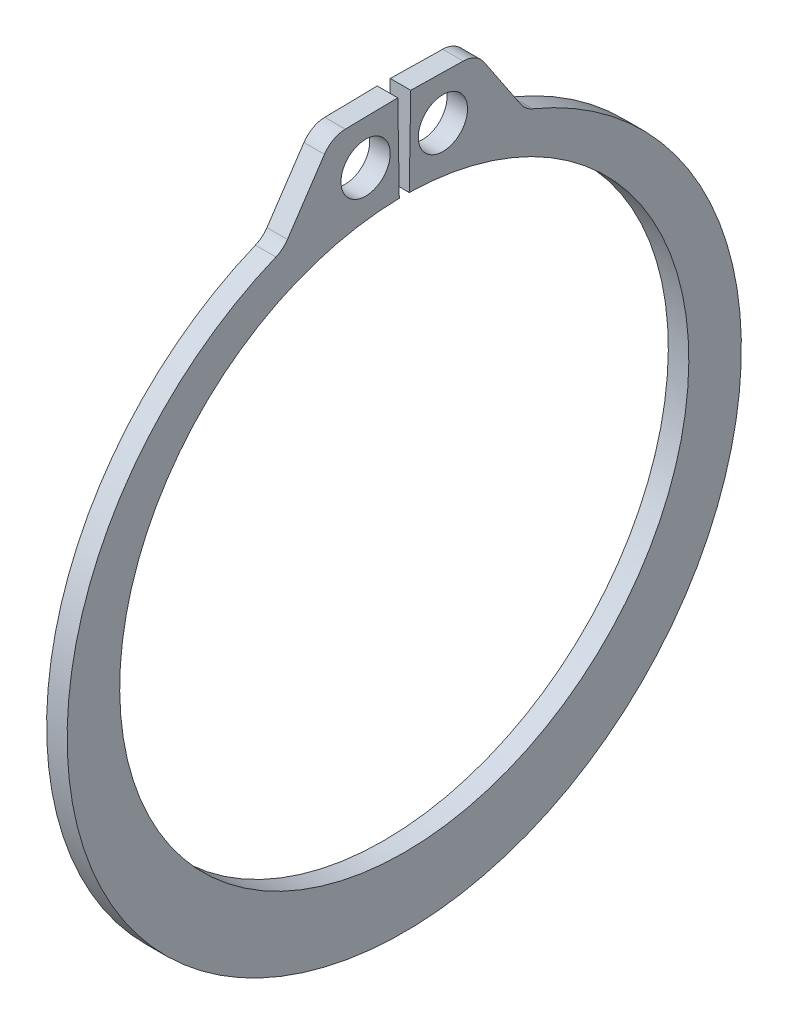
ISO-10303-21;
HEADER;
FILE_DESCRIPTION(('STEP AP214'),'2;1');
FILE_NAME('part.step','',(''),(''),'','','');
FILE_SCHEMA(('AUTOMOTIVE_DESIGN { 1 0 10303 214 1 1 1 1 }'));
ENDSEC;
DATA;
#1=APPLICATION_CONTEXT('core data for automotive mechanical design processes');
#2=APPLICATION_PROTOCOL_DEFINITION('international standard','automotive_design',2000,#1);
#3=PRODUCT_CONTEXT('',#1,'mechanical');
#4=PRODUCT('Part','Part','',(#3));
#5=PRODUCT_RELATED_PRODUCT_CATEGORY('part','',(#4));
#6=PRODUCT_DEFINITION_FORMATION('','',#4);
#7=PRODUCT_DEFINITION_CONTEXT('part definition',#1,'design');
#8=PRODUCT_DEFINITION('design','',#6,#7);
#9=PRODUCT_DEFINITION_SHAPE('','',#8);
#10=(LENGTH_UNIT() NAMED_UNIT(*) SI_UNIT(.MILLI.,.METRE.));
#11=(NAMED_UNIT(*) PLANE_ANGLE_UNIT() SI_UNIT($,.RADIAN.));
#12=(NAMED_UNIT(*) SI_UNIT($,.STERADIAN.) SOLID_ANGLE_UNIT());
#13=UNCERTAINTY_MEASURE_WITH_UNIT(LENGTH_MEASURE(1.E-05),#10,'distance_accuracy_value','');
#14=(GEOMETRIC_REPRESENTATION_CONTEXT(3) GLOBAL_UNCERTAINTY_ASSIGNED_CONTEXT((#13)) GLOBAL_UNIT_ASSIGNED_CONTEXT((#10,
#11,#12)) REPRESENTATION_CONTEXT('',''));
#15=CARTESIAN_POINT('',(0.,0.,0.));
#16=DIRECTION('',(0.,0.,1.));
#17=DIRECTION('',(1.,0.,0.));
#18=AXIS2_PLACEMENT_3D('',#15,#16,#17);
#19=CARTESIAN_POINT('',(0.635,0.,0.));
#20=DIRECTION('',(1.,0.,0.));
#21=DIRECTION('',(0.,0.,-1.));
#22=AXIS2_PLACEMENT_3D('',#19,#20,#21);
#23=PLANE('',#22);
#24=CARTESIAN_POINT('',(0.635,20.2940291186449,2.39289409378939));
#25=DIRECTION('',(1.,0.,0.));
#26=DIRECTION('',(0.,0.,-1.));
#27=AXIS2_PLACEMENT_3D('',#24,#25,#26);
#28=CIRCLE('',#27,1.524);
#29=CARTESIAN_POINT('',(0.635,20.2940291186449,0.868894093789386));
#30=VERTEX_POINT('',#29);
#31=EDGE_CURVE('E221',#30,#30,#28,.T.);
#32=ORIENTED_EDGE('',*,*,#31,.F.);
#33=EDGE_LOOP('',(#32));
#34=FACE_BOUND('',#33,.T.);
#35=DIRECTION('',(0.,-0.0174524064372847,0.999847695156391));
#36=VECTOR('',#35,1.);
#37=CARTESIAN_POINT('',(0.635,23.0469892972024,0.402286694582603));
#38=LINE('',#37,#36);
#39=CARTESIAN_POINT('',(0.635,23.0469892972024,0.402286694582603));
#40=VERTEX_POINT('',#39);
#41=CARTESIAN_POINT('',(0.635,22.9903210915778,3.6488060204965));
#42=VERTEX_POINT('',#41);
#43=EDGE_CURVE('E133',#40,#42,#38,.T.);
#44=ORIENTED_EDGE('',*,*,#43,.T.);
#45=CARTESIAN_POINT('',(0.635,21.4030628755171,3.62110032527731));
#46=DIRECTION('',(1.,0.,0.));
#47=DIRECTION('',(0.,0.,-1.));
#48=AXIS2_PLACEMENT_3D('',#45,#46,#47);
#49=CIRCLE('',#48,1.5875);
#50=CARTESIAN_POINT('',(0.635,22.286493858162,4.9400794566145));
#51=VERTEX_POINT('',#50);
#52=EDGE_CURVE('E174',#42,#51,#49,.T.);
#53=ORIENTED_EDGE('',*,*,#52,.T.);
#54=DIRECTION('',(0.,-0.830852996117914,0.556491957571612));
#55=VECTOR('',#54,1.);
#56=CARTESIAN_POINT('',(0.635,22.9758410718795,4.47836579342666));
#57=LINE('',#56,#55);
#58=CARTESIAN_POINT('',(0.635,18.8685904945311,7.22933609106688));
#59=VERTEX_POINT('',#58);
#60=EDGE_CURVE('E213',#51,#59,#57,.T.);
#61=ORIENTED_EDGE('',*,*,#60,.T.);
#62=CARTESIAN_POINT('',(0.635,19.752021477176,8.54831522240407));
#63=DIRECTION('',(1.,0.,0.));
#64=DIRECTION('',(0.,0.,-1.));
#65=AXIS2_PLACEMENT_3D('',#62,#63,#64);
#66=CIRCLE('',#65,1.5875);
#67=CARTESIAN_POINT('',(0.635,18.2840408963221,7.94400630782837));
#68=VERTEX_POINT('',#67);
#69=EDGE_CURVE('E181',#59,#68,#66,.F.);
#70=ORIENTED_EDGE('',*,*,#69,.T.);
#71=CARTESIAN_POINT('',(0.635,-1.01345201301453,0.));
#72=DIRECTION('',(1.,0.,0.));
#73=DIRECTION('',(0.,0.,-1.));
#74=AXIS2_PLACEMENT_3D('',#71,#72,#73);
#75=CIRCLE('',#74,20.8686479869855);
#76=CARTESIAN_POINT('',(0.635,18.2840408963221,-7.94400630782837));
#77=VERTEX_POINT('',#76);
#78=EDGE_CURVE('E206',#68,#77,#75,.T.);
#79=ORIENTED_EDGE('',*,*,#78,.T.);
#80=CARTESIAN_POINT('',(0.635,19.752021477176,-8.54831522240407));
#81=DIRECTION('',(1.,0.,0.));
#82=DIRECTION('',(0.,0.,-1.));
#83=AXIS2_PLACEMENT_3D('',#80,#81,#82);
#84=CIRCLE('',#83,1.5875);
#85=CARTESIAN_POINT('',(0.635,18.8685904945311,-7.22933609106688));
#86=VERTEX_POINT('',#85);
#87=EDGE_CURVE('E11',#77,#86,#84,.F.);
#88=ORIENTED_EDGE('',*,*,#87,.T.);
#89=DIRECTION('',(0.,0.830852996117914,0.556491957571612));
#90=VECTOR('',#89,1.);
#91=CARTESIAN_POINT('',(0.635,22.9758410718795,-4.47836579342666));
#92=LINE('',#91,#90);
#93=CARTESIAN_POINT('',(0.635,22.286493858162,-4.9400794566145));
#94=VERTEX_POINT('',#93);
#95=EDGE_CURVE('E205',#86,#94,#92,.T.);
#96=ORIENTED_EDGE('',*,*,#95,.T.);
#97=CARTESIAN_POINT('',(0.635,21.4030628755171,-3.62110032527731));
#98=DIRECTION('',(1.,0.,0.));
#99=DIRECTION('',(0.,0.,-1.));
#100=AXIS2_PLACEMENT_3D('',#97,#98,#99);
#101=CIRCLE('',#100,1.5875);
#102=CARTESIAN_POINT('',(0.635,22.9903210915778,-3.6488060204965));
#103=VERTEX_POINT('',#102);
#104=EDGE_CURVE('E49',#94,#103,#101,.T.);
#105=ORIENTED_EDGE('',*,*,#104,.T.);
#106=DIRECTION('',(0.,0.0174524064372847,0.999847695156391));
#107=VECTOR('',#106,1.);
#108=CARTESIAN_POINT('',(0.635,23.0469892972024,-0.402286694582603));
#109=LINE('',#108,#107);
#110=CARTESIAN_POINT('',(0.635,23.0469892972024,-0.402286694582603));
#111=VERTEX_POINT('',#110);
#112=EDGE_CURVE('E210',#103,#111,#109,.T.);
#113=ORIENTED_EDGE('',*,*,#112,.T.);
#114=DIRECTION('',(0.,-0.999847695156391,0.0174524064372834));
#115=VECTOR('',#114,1.);
#116=CARTESIAN_POINT('',(0.635,17.6122171654103,-0.307422394152105));
#117=LINE('',#116,#115);
#118=CARTESIAN_POINT('',(0.635,17.6122171654103,-0.307422394152105));
#119=VERTEX_POINT('',#118);
#120=EDGE_CURVE('E139',#111,#119,#117,.T.);
#121=ORIENTED_EDGE('',*,*,#120,.T.);
#122=CARTESIAN_POINT('',(0.635,0.,0.));
#123=DIRECTION('',(-1.,0.,0.));
#124=DIRECTION('',(0.,0.,-1.));
#125=AXIS2_PLACEMENT_3D('',#122,#123,#124);
#126=CIRCLE('',#125,17.6149);
#127=CARTESIAN_POINT('',(0.635,17.6122171654103,0.307422394152105));
#128=VERTEX_POINT('',#127);
#129=EDGE_CURVE('E134',#119,#128,#126,.T.);
#130=ORIENTED_EDGE('',*,*,#129,.T.);
#131=DIRECTION('',(0.,0.999847695156391,0.0174524064372834));
#132=VECTOR('',#131,1.);
#133=CARTESIAN_POINT('',(0.635,17.6122171654103,0.307422394152105));
#134=LINE('',#133,#132);
#135=EDGE_CURVE('E125',#128,#40,#134,.T.);
#136=ORIENTED_EDGE('',*,*,#135,.T.);
#137=EDGE_LOOP('',(#44,#53,#61,#70,#79,#88,#96,#105,#113,#121,#130,#136));
#138=FACE_BOUND('',#137,.T.);
#139=CARTESIAN_POINT('',(0.635,20.2940291186449,-2.39289409378939));
#140=DIRECTION('',(1.,0.,0.));
#141=DIRECTION('',(0.,0.,-1.));
#142=AXIS2_PLACEMENT_3D('',#139,#140,#141);
#143=CIRCLE('',#142,1.524);
#144=CARTESIAN_POINT('',(0.635,20.2940291186449,-3.91689409378939));
#145=VERTEX_POINT('',#144);
#146=EDGE_CURVE('E247',#145,#145,#143,.T.);
#147=ORIENTED_EDGE('',*,*,#146,.F.);
#148=EDGE_LOOP('',(#147));
#149=FACE_BOUND('',#148,.T.);
#150=ADVANCED_FACE('F34',(#34,#138,#149),#23,.T.);
#151=CARTESIAN_POINT('',(-0.635,0.,0.));
#152=DIRECTION('',(1.,0.,0.));
#153=DIRECTION('',(0.,0.,-1.));
#154=AXIS2_PLACEMENT_3D('',#151,#152,#153);
#155=PLANE('',#154);
#156=CARTESIAN_POINT('',(-0.635,20.2940291186449,2.39289409378939));
#157=DIRECTION('',(1.,0.,0.));
#158=DIRECTION('',(0.,0.,-1.));
#159=AXIS2_PLACEMENT_3D('',#156,#157,#158);
#160=CIRCLE('',#159,1.524);
#161=CARTESIAN_POINT('',(-0.635,20.2940291186449,0.868894093789386));
#162=VERTEX_POINT('',#161);
#163=EDGE_CURVE('E244',#162,#162,#160,.T.);
#164=ORIENTED_EDGE('',*,*,#163,.T.);
#165=EDGE_LOOP('',(#164));
#166=FACE_BOUND('',#165,.T.);
#167=DIRECTION('',(0.,-0.830852996117914,0.556491957571612));
#168=VECTOR('',#167,1.);
#169=CARTESIAN_POINT('',(-0.635,22.9758410718795,4.47836579342666));
#170=LINE('',#169,#168);
#171=CARTESIAN_POINT('',(-0.635,22.286493858162,4.9400794566145));
#172=VERTEX_POINT('',#171);
#173=CARTESIAN_POINT('',(-0.635,18.8685904945311,7.22933609106688));
#174=VERTEX_POINT('',#173);
#175=EDGE_CURVE('E200',#172,#174,#170,.T.);
#176=ORIENTED_EDGE('',*,*,#175,.F.);
#177=CARTESIAN_POINT('',(-0.635,21.4030628755171,3.62110032527731));
#178=DIRECTION('',(1.,0.,0.));
#179=DIRECTION('',(0.,0.,-1.));
#180=AXIS2_PLACEMENT_3D('',#177,#178,#179);
#181=CIRCLE('',#180,1.5875);
#182=CARTESIAN_POINT('',(-0.635,22.9903210915778,3.6488060204965));
#183=VERTEX_POINT('',#182);
#184=EDGE_CURVE('E170',#172,#183,#181,.F.);
#185=ORIENTED_EDGE('',*,*,#184,.T.);
#186=DIRECTION('',(0.,-0.0174524064372847,0.999847695156391));
#187=VECTOR('',#186,1.);
#188=CARTESIAN_POINT('',(-0.635,23.0469892972024,0.402286694582603));
#189=LINE('',#188,#187);
#190=CARTESIAN_POINT('',(-0.635,23.0469892972024,0.402286694582603));
#191=VERTEX_POINT('',#190);
#192=EDGE_CURVE('E223',#191,#183,#189,.T.);
#193=ORIENTED_EDGE('',*,*,#192,.F.);
#194=DIRECTION('',(0.,0.999847695156391,0.0174524064372834));
#195=VECTOR('',#194,1.);
#196=CARTESIAN_POINT('',(-0.635,17.6122171654103,0.307422394152105));
#197=LINE('',#196,#195);
#198=CARTESIAN_POINT('',(-0.635,17.6122171654103,0.307422394152105));
#199=VERTEX_POINT('',#198);
#200=EDGE_CURVE('E220',#199,#191,#197,.T.);
#201=ORIENTED_EDGE('',*,*,#200,.F.);
#202=CARTESIAN_POINT('',(-0.635,0.,0.));
#203=DIRECTION('',(-1.,0.,0.));
#204=DIRECTION('',(0.,0.,-1.));
#205=AXIS2_PLACEMENT_3D('',#202,#203,#204);
#206=CIRCLE('',#205,17.6149);
#207=CARTESIAN_POINT('',(-0.635,17.6122171654103,-0.307422394152105));
#208=VERTEX_POINT('',#207);
#209=EDGE_CURVE('E147',#208,#199,#206,.T.);
#210=ORIENTED_EDGE('',*,*,#209,.F.);
#211=DIRECTION('',(0.,-0.999847695156391,0.0174524064372834));
#212=VECTOR('',#211,1.);
#213=CARTESIAN_POINT('',(-0.635,17.6122171654103,-0.307422394152105));
#214=LINE('',#213,#212);
#215=CARTESIAN_POINT('',(-0.635,23.0469892972024,-0.402286694582603));
#216=VERTEX_POINT('',#215);
#217=EDGE_CURVE('E143',#216,#208,#214,.T.);
#218=ORIENTED_EDGE('',*,*,#217,.F.);
#219=DIRECTION('',(0.,0.0174524064372847,0.999847695156391));
#220=VECTOR('',#219,1.);
#221=CARTESIAN_POINT('',(-0.635,23.0469892972024,-0.402286694582603));
#222=LINE('',#221,#220);
#223=CARTESIAN_POINT('',(-0.635,22.9903210915778,-3.6488060204965));
#224=VERTEX_POINT('',#223);
#225=EDGE_CURVE('E228',#224,#216,#222,.T.);
#226=ORIENTED_EDGE('',*,*,#225,.F.);
#227=CARTESIAN_POINT('',(-0.635,21.4030628755171,-3.62110032527731));
#228=DIRECTION('',(1.,0.,0.));
#229=DIRECTION('',(0.,0.,-1.));
#230=AXIS2_PLACEMENT_3D('',#227,#228,#229);
#231=CIRCLE('',#230,1.5875);
#232=CARTESIAN_POINT('',(-0.635,22.286493858162,-4.9400794566145));
#233=VERTEX_POINT('',#232);
#234=EDGE_CURVE('E168',#224,#233,#231,.F.);
#235=ORIENTED_EDGE('',*,*,#234,.T.);
#236=DIRECTION('',(0.,0.830852996117914,0.556491957571612));
#237=VECTOR('',#236,1.);
#238=CARTESIAN_POINT('',(-0.635,22.9758410718795,-4.47836579342666));
#239=LINE('',#238,#237);
#240=CARTESIAN_POINT('',(-0.635,18.8685904945311,-7.22933609106688));
#241=VERTEX_POINT('',#240);
#242=EDGE_CURVE('E191',#241,#233,#239,.T.);
#243=ORIENTED_EDGE('',*,*,#242,.F.);
#244=CARTESIAN_POINT('',(-0.635,19.752021477176,-8.54831522240407));
#245=DIRECTION('',(1.,0.,0.));
#246=DIRECTION('',(0.,0.,-1.));
#247=AXIS2_PLACEMENT_3D('',#244,#245,#246);
#248=CIRCLE('',#247,1.5875);
#249=CARTESIAN_POINT('',(-0.635,18.2840408963221,-7.94400630782837));
#250=VERTEX_POINT('',#249);
#251=EDGE_CURVE('E42',#241,#250,#248,.T.);
#252=ORIENTED_EDGE('',*,*,#251,.T.);
#253=CARTESIAN_POINT('',(-0.635,-1.01345201301453,0.));
#254=DIRECTION('',(1.,0.,0.));
#255=DIRECTION('',(0.,0.,-1.));
#256=AXIS2_PLACEMENT_3D('',#253,#254,#255);
#257=CIRCLE('',#256,20.8686479869855);
#258=CARTESIAN_POINT('',(-0.635,18.2840408963221,7.94400630782837));
#259=VERTEX_POINT('',#258);
#260=EDGE_CURVE('E189',#259,#250,#257,.T.);
#261=ORIENTED_EDGE('',*,*,#260,.F.);
#262=CARTESIAN_POINT('',(-0.635,19.752021477176,8.54831522240407));
#263=DIRECTION('',(1.,0.,0.));
#264=DIRECTION('',(0.,0.,-1.));
#265=AXIS2_PLACEMENT_3D('',#262,#263,#264);
#266=CIRCLE('',#265,1.5875);
#267=EDGE_CURVE('E179',#259,#174,#266,.T.);
#268=ORIENTED_EDGE('',*,*,#267,.T.);
#269=EDGE_LOOP('',(#176,#185,#193,#201,#210,#218,#226,#235,#243,#252,#261,#268));
#270=FACE_BOUND('',#269,.T.);
#271=CARTESIAN_POINT('',(-0.635,20.2940291186449,-2.39289409378939));
#272=DIRECTION('',(1.,0.,0.));
#273=DIRECTION('',(0.,0.,-1.));
#274=AXIS2_PLACEMENT_3D('',#271,#272,#273);
#275=CIRCLE('',#274,1.524);
#276=CARTESIAN_POINT('',(-0.635,20.2940291186449,-3.91689409378939));
#277=VERTEX_POINT('',#276);
#278=EDGE_CURVE('E250',#277,#277,#275,.T.);
#279=ORIENTED_EDGE('',*,*,#278,.T.);
#280=EDGE_LOOP('',(#279));
#281=FACE_BOUND('',#280,.T.);
#282=ADVANCED_FACE('F187',(#166,#270,#281),#155,.F.);
#283=CARTESIAN_POINT('',(0.635,0.,0.));
#284=DIRECTION('',(-1.,0.,0.));
#285=DIRECTION('',(0.,0.,1.));
#286=AXIS2_PLACEMENT_3D('',#283,#284,#285);
#287=CYLINDRICAL_SURFACE('',#286,17.6149);
#288=ORIENTED_EDGE('',*,*,#209,.T.);
#289=DIRECTION('',(-1.,0.,0.));
#290=VECTOR('',#289,1.);
#291=CARTESIAN_POINT('',(0.635,17.6122171654103,0.307422394152105));
#292=LINE('',#291,#290);
#293=EDGE_CURVE('E129',#128,#199,#292,.T.);
#294=ORIENTED_EDGE('',*,*,#293,.F.);
#295=ORIENTED_EDGE('',*,*,#129,.F.);
#296=DIRECTION('',(-1.,0.,0.));
#297=VECTOR('',#296,1.);
#298=CARTESIAN_POINT('',(0.635,17.6122171654103,-0.307422394152105));
#299=LINE('',#298,#297);
#300=EDGE_CURVE('E218',#119,#208,#299,.T.);
#301=ORIENTED_EDGE('',*,*,#300,.T.);
#302=EDGE_LOOP('',(#288,#294,#295,#301));
#303=FACE_BOUND('',#302,.T.);
#304=ADVANCED_FACE('F145',(#303),#287,.F.);
#305=CARTESIAN_POINT('',(0.635,17.6122171654103,0.307422394152105));
#306=DIRECTION('',(0.,-0.0174524064372834,0.999847695156391));
#307=DIRECTION('',(0.,-0.999847695156391,-0.0174524064372834));
#308=AXIS2_PLACEMENT_3D('',#305,#306,#307);
#309=PLANE('',#308);
#310=ORIENTED_EDGE('',*,*,#200,.T.);
#311=DIRECTION('',(-1.,0.,0.));
#312=VECTOR('',#311,1.);
#313=CARTESIAN_POINT('',(0.635,23.0469892972024,0.402286694582603));
#314=LINE('',#313,#312);
#315=EDGE_CURVE('E132',#40,#191,#314,.T.);
#316=ORIENTED_EDGE('',*,*,#315,.F.);
#317=ORIENTED_EDGE('',*,*,#135,.F.);
#318=ORIENTED_EDGE('',*,*,#293,.T.);
#319=EDGE_LOOP('',(#310,#316,#317,#318));
#320=FACE_BOUND('',#319,.T.);
#321=ADVANCED_FACE('F127',(#320),#309,.F.);
#322=CARTESIAN_POINT('',(0.635,23.0469892972024,0.402286694582603));
#323=DIRECTION('',(0.,-0.999847695156391,-0.0174524064372847));
#324=DIRECTION('',(0.,0.0174524064372847,-0.999847695156391));
#325=AXIS2_PLACEMENT_3D('',#322,#323,#324);
#326=PLANE('',#325);
#327=ORIENTED_EDGE('',*,*,#192,.T.);
#328=DIRECTION('',(-1.,0.,0.));
#329=VECTOR('',#328,1.);
#330=CARTESIAN_POINT('',(0.635,22.9903210915778,3.64880602049649));
#331=LINE('',#330,#329);
#332=EDGE_CURVE('E57',#183,#42,#331,.F.);
#333=ORIENTED_EDGE('',*,*,#332,.T.);
#334=ORIENTED_EDGE('',*,*,#43,.F.);
#335=ORIENTED_EDGE('',*,*,#315,.T.);
#336=EDGE_LOOP('',(#327,#333,#334,#335));
#337=FACE_BOUND('',#336,.T.);
#338=ADVANCED_FACE('F239',(#337),#326,.F.);
#339=CARTESIAN_POINT('',(0.635,22.9758410718795,4.47836579342666));
#340=DIRECTION('',(0.,-0.556491957571612,-0.830852996117915));
#341=DIRECTION('',(0.,0.830852996117915,-0.556491957571612));
#342=AXIS2_PLACEMENT_3D('',#339,#340,#341);
#343=PLANE('',#342);
#344=ORIENTED_EDGE('',*,*,#175,.T.);
#345=DIRECTION('',(1.,0.,0.));
#346=VECTOR('',#345,1.);
#347=CARTESIAN_POINT('',(0.635,18.8685904945311,7.22933609106687));
#348=LINE('',#347,#346);
#349=EDGE_CURVE('E161',#174,#59,#348,.T.);
#350=ORIENTED_EDGE('',*,*,#349,.T.);
#351=ORIENTED_EDGE('',*,*,#60,.F.);
#352=DIRECTION('',(-1.,0.,0.));
#353=VECTOR('',#352,1.);
#354=CARTESIAN_POINT('',(0.635,22.286493858162,4.9400794566145));
#355=LINE('',#354,#353);
#356=EDGE_CURVE('E158',#51,#172,#355,.T.);
#357=ORIENTED_EDGE('',*,*,#356,.T.);
#358=EDGE_LOOP('',(#344,#350,#351,#357));
#359=FACE_BOUND('',#358,.T.);
#360=ADVANCED_FACE('F280',(#359),#343,.F.);
#361=CARTESIAN_POINT('',(0.635,-1.01345201301453,0.));
#362=DIRECTION('',(-1.,0.,0.));
#363=DIRECTION('',(0.,0.,1.));
#364=AXIS2_PLACEMENT_3D('',#361,#362,#363);
#365=CYLINDRICAL_SURFACE('',#364,20.8686479869855);
#366=ORIENTED_EDGE('',*,*,#78,.F.);
#367=DIRECTION('',(-1.,0.,0.));
#368=VECTOR('',#367,1.);
#369=CARTESIAN_POINT('',(0.635,18.2840408963221,7.94400630782837));
#370=LINE('',#369,#368);
#371=EDGE_CURVE('E150',#68,#259,#370,.T.);
#372=ORIENTED_EDGE('',*,*,#371,.T.);
#373=ORIENTED_EDGE('',*,*,#260,.T.);
#374=DIRECTION('',(-1.,0.,0.));
#375=VECTOR('',#374,1.);
#376=CARTESIAN_POINT('',(0.635,18.2840408963221,-7.94400630782837));
#377=LINE('',#376,#375);
#378=EDGE_CURVE('E148',#250,#77,#377,.F.);
#379=ORIENTED_EDGE('',*,*,#378,.T.);
#380=EDGE_LOOP('',(#366,#372,#373,#379));
#381=FACE_BOUND('',#380,.T.);
#382=ADVANCED_FACE('F197',(#381),#365,.T.);
#383=CARTESIAN_POINT('',(0.635,22.9758410718795,-4.47836579342666));
#384=DIRECTION('',(0.,-0.556491957571612,0.830852996117915));
#385=DIRECTION('',(0.,-0.830852996117915,-0.556491957571612));
#386=AXIS2_PLACEMENT_3D('',#383,#384,#385);
#387=PLANE('',#386);
#388=ORIENTED_EDGE('',*,*,#95,.F.);
#389=DIRECTION('',(1.,0.,0.));
#390=VECTOR('',#389,1.);
#391=CARTESIAN_POINT('',(-0.635,18.8685904945311,-7.22933609106687));
#392=LINE('',#391,#390);
#393=EDGE_CURVE('E165',#86,#241,#392,.F.);
#394=ORIENTED_EDGE('',*,*,#393,.T.);
#395=ORIENTED_EDGE('',*,*,#242,.T.);
#396=DIRECTION('',(-1.,0.,0.));
#397=VECTOR('',#396,1.);
#398=CARTESIAN_POINT('',(0.635,22.286493858162,-4.9400794566145));
#399=LINE('',#398,#397);
#400=EDGE_CURVE('E163',#233,#94,#399,.F.);
#401=ORIENTED_EDGE('',*,*,#400,.T.);
#402=EDGE_LOOP('',(#388,#394,#395,#401));
#403=FACE_BOUND('',#402,.T.);
#404=ADVANCED_FACE('F208',(#403),#387,.F.);
#405=CARTESIAN_POINT('',(0.635,23.0469892972024,-0.402286694582603));
#406=DIRECTION('',(0.,-0.999847695156391,0.0174524064372847));
#407=DIRECTION('',(0.,-0.0174524064372847,-0.999847695156391));
#408=AXIS2_PLACEMENT_3D('',#405,#406,#407);
#409=PLANE('',#408);
#410=ORIENTED_EDGE('',*,*,#112,.F.);
#411=DIRECTION('',(-1.,0.,0.));
#412=VECTOR('',#411,1.);
#413=CARTESIAN_POINT('',(0.635,22.9903210915778,-3.6488060204965));
#414=LINE('',#413,#412);
#415=EDGE_CURVE('E176',#103,#224,#414,.T.);
#416=ORIENTED_EDGE('',*,*,#415,.T.);
#417=ORIENTED_EDGE('',*,*,#225,.T.);
#418=DIRECTION('',(-1.,0.,0.));
#419=VECTOR('',#418,1.);
#420=CARTESIAN_POINT('',(0.635,23.0469892972024,-0.402286694582603));
#421=LINE('',#420,#419);
#422=EDGE_CURVE('E152',#111,#216,#421,.T.);
#423=ORIENTED_EDGE('',*,*,#422,.F.);
#424=EDGE_LOOP('',(#410,#416,#417,#423));
#425=FACE_BOUND('',#424,.T.);
#426=ADVANCED_FACE('F273',(#425),#409,.F.);
#427=CARTESIAN_POINT('',(0.635,17.6122171654103,-0.307422394152105));
#428=DIRECTION('',(0.,-0.0174524064372834,-0.999847695156391));
#429=DIRECTION('',(0.,0.999847695156391,-0.0174524064372834));
#430=AXIS2_PLACEMENT_3D('',#427,#428,#429);
#431=PLANE('',#430);
#432=ORIENTED_EDGE('',*,*,#217,.T.);
#433=ORIENTED_EDGE('',*,*,#300,.F.);
#434=ORIENTED_EDGE('',*,*,#120,.F.);
#435=ORIENTED_EDGE('',*,*,#422,.T.);
#436=EDGE_LOOP('',(#432,#433,#434,#435));
#437=FACE_BOUND('',#436,.T.);
#438=ADVANCED_FACE('F235',(#437),#431,.F.);
#439=CARTESIAN_POINT('',(0.635,20.2940291186449,2.39289409378939));
#440=DIRECTION('',(-1.,0.,0.));
#441=DIRECTION('',(0.,0.,1.));
#442=AXIS2_PLACEMENT_3D('',#439,#440,#441);
#443=CYLINDRICAL_SURFACE('',#442,1.524);
#444=ORIENTED_EDGE('',*,*,#31,.T.);
#445=EDGE_LOOP('',(#444));
#446=FACE_BOUND('',#445,.T.);
#447=ORIENTED_EDGE('',*,*,#163,.F.);
#448=EDGE_LOOP('',(#447));
#449=FACE_BOUND('',#448,.T.);
#450=ADVANCED_FACE('F268',(#446,#449),#443,.F.);
#451=CARTESIAN_POINT('',(0.635,20.2940291186449,-2.39289409378939));
#452=DIRECTION('',(-1.,0.,0.));
#453=DIRECTION('',(0.,0.,1.));
#454=AXIS2_PLACEMENT_3D('',#451,#452,#453);
#455=CYLINDRICAL_SURFACE('',#454,1.524);
#456=ORIENTED_EDGE('',*,*,#146,.T.);
#457=EDGE_LOOP('',(#456));
#458=FACE_BOUND('',#457,.T.);
#459=ORIENTED_EDGE('',*,*,#278,.F.);
#460=EDGE_LOOP('',(#459));
#461=FACE_BOUND('',#460,.T.);
#462=ADVANCED_FACE('F256',(#458,#461),#455,.F.);
#463=CARTESIAN_POINT('',(0.635,19.752021477176,8.54831522240407));
#464=DIRECTION('',(-1.,0.,0.));
#465=DIRECTION('',(0.,0.,1.));
#466=AXIS2_PLACEMENT_3D('',#463,#464,#465);
#467=CYLINDRICAL_SURFACE('',#466,1.5875);
#468=ORIENTED_EDGE('',*,*,#69,.F.);
#469=ORIENTED_EDGE('',*,*,#349,.F.);
#470=ORIENTED_EDGE('',*,*,#267,.F.);
#471=ORIENTED_EDGE('',*,*,#371,.F.);
#472=EDGE_LOOP('',(#468,#469,#470,#471));
#473=FACE_BOUND('',#472,.T.);
#474=ADVANCED_FACE('F290',(#473),#467,.F.);
#475=CARTESIAN_POINT('',(0.635,19.752021477176,-8.54831522240407));
#476=DIRECTION('',(-1.,0.,0.));
#477=DIRECTION('',(0.,0.,1.));
#478=AXIS2_PLACEMENT_3D('',#475,#476,#477);
#479=CYLINDRICAL_SURFACE('',#478,1.5875);
#480=ORIENTED_EDGE('',*,*,#87,.F.);
#481=ORIENTED_EDGE('',*,*,#378,.F.);
#482=ORIENTED_EDGE('',*,*,#251,.F.);
#483=ORIENTED_EDGE('',*,*,#393,.F.);
#484=EDGE_LOOP('',(#480,#481,#482,#483));
#485=FACE_BOUND('',#484,.T.);
#486=ADVANCED_FACE('F203',(#485),#479,.F.);
#487=CARTESIAN_POINT('',(0.635,21.4030628755171,3.62110032527731));
#488=DIRECTION('',(-1.,0.,0.));
#489=DIRECTION('',(0.,0.,1.));
#490=AXIS2_PLACEMENT_3D('',#487,#488,#489);
#491=CYLINDRICAL_SURFACE('',#490,1.5875);
#492=ORIENTED_EDGE('',*,*,#52,.F.);
#493=ORIENTED_EDGE('',*,*,#332,.F.);
#494=ORIENTED_EDGE('',*,*,#184,.F.);
#495=ORIENTED_EDGE('',*,*,#356,.F.);
#496=EDGE_LOOP('',(#492,#493,#494,#495));
#497=FACE_BOUND('',#496,.T.);
#498=ADVANCED_FACE('F295',(#497),#491,.T.);
#499=CARTESIAN_POINT('',(0.635,21.4030628755171,-3.62110032527731));
#500=DIRECTION('',(-1.,0.,0.));
#501=DIRECTION('',(0.,0.,1.));
#502=AXIS2_PLACEMENT_3D('',#499,#500,#501);
#503=CYLINDRICAL_SURFACE('',#502,1.5875);
#504=ORIENTED_EDGE('',*,*,#104,.F.);
#505=ORIENTED_EDGE('',*,*,#400,.F.);
#506=ORIENTED_EDGE('',*,*,#234,.F.);
#507=ORIENTED_EDGE('',*,*,#415,.F.);
#508=EDGE_LOOP('',(#504,#505,#506,#507));
#509=FACE_BOUND('',#508,.T.);
#510=ADVANCED_FACE('F36',(#509),#503,.T.);
#511=CLOSED_SHELL('',(#150,#282,#304,#321,#338,#360,#382,#404,#426,#438,#450,#462,#474,#486,
#498,#510));
#512=MANIFOLD_SOLID_BREP('B2',#511);
#513=ADVANCED_BREP_SHAPE_REPRESENTATION('',(#18,#512),#14);
#514=SHAPE_DEFINITION_REPRESENTATION(#9,#513);
ENDSEC;
END-ISO-10303-21;
